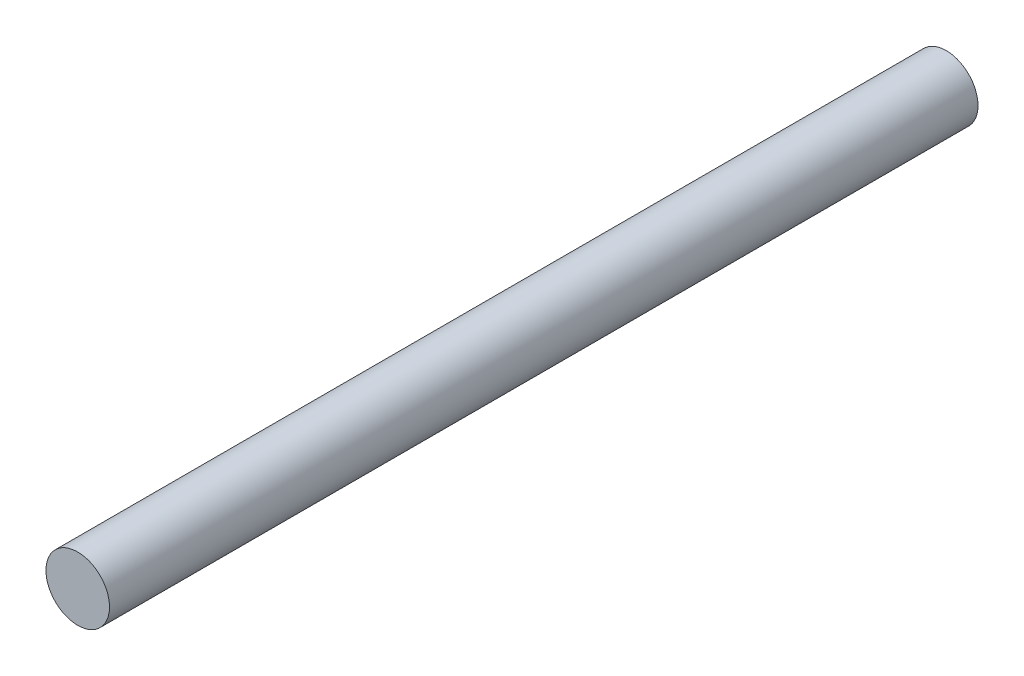
ISO-10303-21;
HEADER;
FILE_DESCRIPTION(('STEP AP214'),'2;1');
FILE_NAME('part.step','',(''),(''),'','','');
FILE_SCHEMA(('AUTOMOTIVE_DESIGN { 1 0 10303 214 1 1 1 1 }'));
ENDSEC;
DATA;
#1=APPLICATION_CONTEXT('core data for automotive mechanical design processes');
#2=APPLICATION_PROTOCOL_DEFINITION('international standard','automotive_design',2000,#1);
#3=PRODUCT_CONTEXT('',#1,'mechanical');
#4=PRODUCT('Part','Part','',(#3));
#5=PRODUCT_RELATED_PRODUCT_CATEGORY('part','',(#4));
#6=PRODUCT_DEFINITION_FORMATION('','',#4);
#7=PRODUCT_DEFINITION_CONTEXT('part definition',#1,'design');
#8=PRODUCT_DEFINITION('design','',#6,#7);
#9=PRODUCT_DEFINITION_SHAPE('','',#8);
#10=(LENGTH_UNIT() NAMED_UNIT(*) SI_UNIT(.MILLI.,.METRE.));
#11=(NAMED_UNIT(*) PLANE_ANGLE_UNIT() SI_UNIT($,.RADIAN.));
#12=(NAMED_UNIT(*) SI_UNIT($,.STERADIAN.) SOLID_ANGLE_UNIT());
#13=UNCERTAINTY_MEASURE_WITH_UNIT(LENGTH_MEASURE(1.E-05),#10,'distance_accuracy_value','');
#14=(GEOMETRIC_REPRESENTATION_CONTEXT(3) GLOBAL_UNCERTAINTY_ASSIGNED_CONTEXT((#13)) GLOBAL_UNIT_ASSIGNED_CONTEXT((#10,
#11,#12)) REPRESENTATION_CONTEXT('',''));
#15=CARTESIAN_POINT('',(0.,0.,0.));
#16=DIRECTION('',(0.,0.,1.));
#17=DIRECTION('',(1.,0.,0.));
#18=AXIS2_PLACEMENT_3D('',#15,#16,#17);
#19=CARTESIAN_POINT('',(0.,0.,82.));
#20=DIRECTION('',(0.,0.,-1.));
#21=DIRECTION('',(0.,-1.,0.));
#22=AXIS2_PLACEMENT_3D('',#19,#20,#21);
#23=CYLINDRICAL_SURFACE('',#22,3.);
#24=CARTESIAN_POINT('',(0.,0.,82.));
#25=DIRECTION('',(0.,0.,1.));
#26=DIRECTION('',(1.,0.,0.));
#27=AXIS2_PLACEMENT_3D('',#24,#25,#26);
#28=CIRCLE('',#27,3.);
#29=CARTESIAN_POINT('',(3.,0.,82.));
#30=VERTEX_POINT('',#29);
#31=EDGE_CURVE('E19',#30,#30,#28,.T.);
#32=ORIENTED_EDGE('',*,*,#31,.F.);
#33=EDGE_LOOP('',(#32));
#34=FACE_BOUND('',#33,.T.);
#35=CARTESIAN_POINT('',(0.,0.,0.));
#36=DIRECTION('',(0.,0.,1.));
#37=DIRECTION('',(1.,0.,0.));
#38=AXIS2_PLACEMENT_3D('',#35,#36,#37);
#39=CIRCLE('',#38,3.);
#40=CARTESIAN_POINT('',(3.,0.,0.));
#41=VERTEX_POINT('',#40);
#42=EDGE_CURVE('E8',#41,#41,#39,.T.);
#43=ORIENTED_EDGE('',*,*,#42,.T.);
#44=EDGE_LOOP('',(#43));
#45=FACE_BOUND('',#44,.T.);
#46=ADVANCED_FACE('F13',(#34,#45),#23,.T.);
#47=CARTESIAN_POINT('',(0.,0.,82.));
#48=DIRECTION('',(0.,0.,1.));
#49=DIRECTION('',(1.,0.,0.));
#50=AXIS2_PLACEMENT_3D('',#47,#48,#49);
#51=PLANE('',#50);
#52=ORIENTED_EDGE('',*,*,#31,.T.);
#53=EDGE_LOOP('',(#52));
#54=FACE_BOUND('',#53,.T.);
#55=ADVANCED_FACE('F25',(#54),#51,.T.);
#56=CARTESIAN_POINT('',(0.,0.,0.));
#57=DIRECTION('',(0.,0.,1.));
#58=DIRECTION('',(1.,0.,0.));
#59=AXIS2_PLACEMENT_3D('',#56,#57,#58);
#60=PLANE('',#59);
#61=ORIENTED_EDGE('',*,*,#42,.F.);
#62=EDGE_LOOP('',(#61));
#63=FACE_BOUND('',#62,.T.);
#64=ADVANCED_FACE('F32',(#63),#60,.F.);
#65=CLOSED_SHELL('',(#46,#55,#64));
#66=MANIFOLD_SOLID_BREP('B1',#65);
#67=ADVANCED_BREP_SHAPE_REPRESENTATION('',(#18,#66),#14);
#68=SHAPE_DEFINITION_REPRESENTATION(#9,#67);
ENDSEC;
END-ISO-10303-21;
